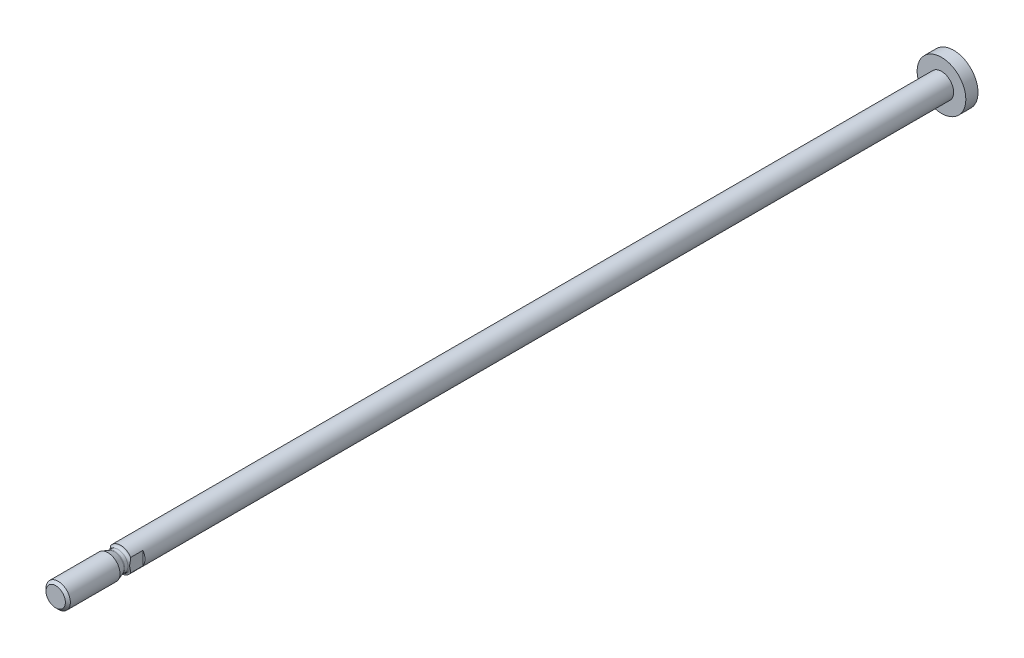
ISO-10303-21;
HEADER;
FILE_DESCRIPTION(('STEP AP214'),'2;1');
FILE_NAME('part.step','',(''),(''),'','','');
FILE_SCHEMA(('AUTOMOTIVE_DESIGN { 1 0 10303 214 1 1 1 1 }'));
ENDSEC;
DATA;
#1=APPLICATION_CONTEXT('core data for automotive mechanical design processes');
#2=APPLICATION_PROTOCOL_DEFINITION('international standard','automotive_design',2000,#1);
#3=PRODUCT_CONTEXT('',#1,'mechanical');
#4=PRODUCT('Part','Part','',(#3));
#5=PRODUCT_RELATED_PRODUCT_CATEGORY('part','',(#4));
#6=PRODUCT_DEFINITION_FORMATION('','',#4);
#7=PRODUCT_DEFINITION_CONTEXT('part definition',#1,'design');
#8=PRODUCT_DEFINITION('design','',#6,#7);
#9=PRODUCT_DEFINITION_SHAPE('','',#8);
#10=(LENGTH_UNIT() NAMED_UNIT(*) SI_UNIT(.MILLI.,.METRE.));
#11=(NAMED_UNIT(*) PLANE_ANGLE_UNIT() SI_UNIT($,.RADIAN.));
#12=(NAMED_UNIT(*) SI_UNIT($,.STERADIAN.) SOLID_ANGLE_UNIT());
#13=UNCERTAINTY_MEASURE_WITH_UNIT(LENGTH_MEASURE(1.E-05),#10,'distance_accuracy_value','');
#14=(GEOMETRIC_REPRESENTATION_CONTEXT(3) GLOBAL_UNCERTAINTY_ASSIGNED_CONTEXT((#13)) GLOBAL_UNIT_ASSIGNED_CONTEXT((#10,
#11,#12)) REPRESENTATION_CONTEXT('',''));
#15=CARTESIAN_POINT('',(0.,0.,0.));
#16=DIRECTION('',(0.,0.,1.));
#17=DIRECTION('',(1.,0.,0.));
#18=AXIS2_PLACEMENT_3D('',#15,#16,#17);
#19=CARTESIAN_POINT('',(0.,0.,-200.3));
#20=DIRECTION('',(0.,0.,1.));
#21=DIRECTION('',(1.,0.,0.));
#22=AXIS2_PLACEMENT_3D('',#19,#20,#21);
#23=CYLINDRICAL_SURFACE('',#22,3.);
#24=CARTESIAN_POINT('',(0.,0.,-197.3));
#25=DIRECTION('',(0.,0.,1.));
#26=DIRECTION('',(1.,0.,0.));
#27=AXIS2_PLACEMENT_3D('',#24,#25,#26);
#28=CIRCLE('',#27,3.);
#29=CARTESIAN_POINT('',(3.,0.,-197.3));
#30=VERTEX_POINT('',#29);
#31=EDGE_CURVE('E134',#30,#30,#28,.T.);
#32=ORIENTED_EDGE('',*,*,#31,.T.);
#33=EDGE_LOOP('',(#32));
#34=FACE_BOUND('',#33,.T.);
#35=DIRECTION('',(0.,0.,1.));
#36=VECTOR('',#35,1.);
#37=CARTESIAN_POINT('',(-2.5,-1.6583123951777,-200.3));
#38=LINE('',#37,#36);
#39=CARTESIAN_POINT('',(-2.5,-1.6583123951777,2.));
#40=VERTEX_POINT('',#39);
#41=CARTESIAN_POINT('',(-2.5,-1.6583123951777,5.));
#42=VERTEX_POINT('',#41);
#43=EDGE_CURVE('E64',#40,#42,#38,.T.);
#44=ORIENTED_EDGE('',*,*,#43,.F.);
#45=CARTESIAN_POINT('',(0.,0.,2.));
#46=DIRECTION('',(0.,0.,1.));
#47=DIRECTION('',(1.,0.,0.));
#48=AXIS2_PLACEMENT_3D('',#45,#46,#47);
#49=CIRCLE('',#48,3.);
#50=CARTESIAN_POINT('',(-2.5,1.6583123951777,2.));
#51=VERTEX_POINT('',#50);
#52=EDGE_CURVE('E13',#51,#40,#49,.T.);
#53=ORIENTED_EDGE('',*,*,#52,.F.);
#54=DIRECTION('',(0.,0.,1.));
#55=VECTOR('',#54,1.);
#56=CARTESIAN_POINT('',(-2.5,1.6583123951777,-200.3));
#57=LINE('',#56,#55);
#58=CARTESIAN_POINT('',(-2.5,1.65831239517778,4.99999999999909));
#59=VERTEX_POINT('',#58);
#60=EDGE_CURVE('E104',#59,#51,#57,.F.);
#61=ORIENTED_EDGE('',*,*,#60,.F.);
#62=CARTESIAN_POINT('',(0.,0.,5.));
#63=DIRECTION('',(0.,0.,1.));
#64=DIRECTION('',(1.,0.,0.));
#65=AXIS2_PLACEMENT_3D('',#62,#63,#64);
#66=CIRCLE('',#65,3.);
#67=CARTESIAN_POINT('',(2.5,1.6583123951777,5.));
#68=VERTEX_POINT('',#67);
#69=EDGE_CURVE('E103',#68,#59,#66,.T.);
#70=ORIENTED_EDGE('',*,*,#69,.F.);
#71=DIRECTION('',(0.,0.,1.));
#72=VECTOR('',#71,1.);
#73=CARTESIAN_POINT('',(2.5,1.6583123951777,-200.3));
#74=LINE('',#73,#72);
#75=CARTESIAN_POINT('',(2.5,1.6583123951777,2.));
#76=VERTEX_POINT('',#75);
#77=EDGE_CURVE('E72',#76,#68,#74,.T.);
#78=ORIENTED_EDGE('',*,*,#77,.F.);
#79=CARTESIAN_POINT('',(2.5,-1.6583123951777,2.));
#80=VERTEX_POINT('',#79);
#81=EDGE_CURVE('E53',#80,#76,#49,.T.);
#82=ORIENTED_EDGE('',*,*,#81,.F.);
#83=DIRECTION('',(0.,0.,1.));
#84=VECTOR('',#83,1.);
#85=CARTESIAN_POINT('',(2.5,-1.6583123951777,-200.3));
#86=LINE('',#85,#84);
#87=CARTESIAN_POINT('',(2.5,-1.65831239517778,4.99999999999909));
#88=VERTEX_POINT('',#87);
#89=EDGE_CURVE('E97',#88,#80,#86,.F.);
#90=ORIENTED_EDGE('',*,*,#89,.F.);
#91=EDGE_CURVE('E137',#42,#88,#66,.T.);
#92=ORIENTED_EDGE('',*,*,#91,.F.);
#93=EDGE_LOOP('',(#44,#53,#61,#70,#78,#82,#90,#92));
#94=FACE_BOUND('',#93,.T.);
#95=ADVANCED_FACE('F50',(#34,#94),#23,.T.);
#96=CARTESIAN_POINT('',(0.,0.,5.6000000000001));
#97=DIRECTION('',(0.,0.,1.));
#98=DIRECTION('',(1.,0.,0.));
#99=AXIS2_PLACEMENT_3D('',#96,#97,#98);
#100=TOROIDAL_SURFACE('',#99,3.0000000000001,0.600000000000099);
#101=CARTESIAN_POINT('',(0.,0.,5.6));
#102=DIRECTION('',(0.,0.,1.));
#103=DIRECTION('',(1.,0.,0.));
#104=AXIS2_PLACEMENT_3D('',#101,#102,#103);
#105=CIRCLE('',#104,2.4);
#106=CARTESIAN_POINT('',(2.4,0.,5.6));
#107=VERTEX_POINT('',#106);
#108=EDGE_CURVE('E125',#107,#107,#105,.T.);
#109=ORIENTED_EDGE('',*,*,#108,.F.);
#110=EDGE_LOOP('',(#109));
#111=FACE_BOUND('',#110,.T.);
#112=CARTESIAN_POINT('',(-2.5,0.,5.26833752096453));
#113=CARTESIAN_POINT('',(-2.5,0.0507234426297441,5.26834839993848));
#114=CARTESIAN_POINT('',(-2.5,0.101441776799662,5.26596843791489));
#115=CARTESIAN_POINT('',(-2.5,0.202536067556288,5.2569952015163));
#116=CARTESIAN_POINT('',(-2.5,0.252911588949165,5.2503973212644));
#117=CARTESIAN_POINT('',(-2.5,0.35392632203634,5.23403658213965));
#118=CARTESIAN_POINT('',(-2.5,0.404557369480025,5.224225913585));
#119=CARTESIAN_POINT('',(-2.5,0.505400398866161,5.20278595137819));
#120=CARTESIAN_POINT('',(-2.5,0.555612509775304,5.1911572409283));
#121=CARTESIAN_POINT('',(-2.5,0.655655613826413,5.16721678219831));
#122=CARTESIAN_POINT('',(-2.5,0.705487327239528,5.15490798008948));
#123=CARTESIAN_POINT('',(-2.5,0.805181864056362,5.13041893752706));
#124=CARTESIAN_POINT('',(-2.5,0.855044688832192,5.11823870324147));
#125=CARTESIAN_POINT('',(-2.5,1.00507376125951,5.08293674920261));
#126=CARTESIAN_POINT('',(-2.5,1.1055660279648,5.06108488117838));
#127=CARTESIAN_POINT('',(-2.5,1.30645493621981,5.02592717471424));
#128=CARTESIAN_POINT('',(-2.5,1.40682678389803,5.01248870030289));
#129=CARTESIAN_POINT('',(-2.5,1.60840199518987,4.99838763017595));
#130=CARTESIAN_POINT('',(-2.5,1.70960094347028,4.99767823287719));
#131=CARTESIAN_POINT('',(-2.5,1.86622781794818,5.01106448653587));
#132=CARTESIAN_POINT('',(-2.5,1.92218137883188,5.01877622049858));
#133=CARTESIAN_POINT('',(-2.5,2.03285053262341,5.0413651074687));
#134=CARTESIAN_POINT('',(-2.5,2.08756307823151,5.05625824117348));
#135=CARTESIAN_POINT('',(-2.5,2.18328084843635,5.09083457513036));
#136=CARTESIAN_POINT('',(-2.5,2.22483950461237,5.10896465354793));
#137=CARTESIAN_POINT('',(-2.5,2.30459524648064,5.1515245306446));
#138=CARTESIAN_POINT('',(-2.5,2.34279989724468,5.17593963670877));
#139=CARTESIAN_POINT('',(-2.5,2.40362753966407,5.22361594487622));
#140=CARTESIAN_POINT('',(-2.5,2.42757076392253,5.24518752529637));
#141=CARTESIAN_POINT('',(-2.5,2.47175757689057,5.29185573262645));
#142=CARTESIAN_POINT('',(-2.5,2.49200531158724,5.31694835263777));
#143=CARTESIAN_POINT('',(-2.5,2.52468492158815,5.36594738678137));
#144=CARTESIAN_POINT('',(-2.5,2.53785643218482,5.38935828111803));
#145=CARTESIAN_POINT('',(-2.5,2.56013164913301,5.43805384411947));
#146=CARTESIAN_POINT('',(-2.5,2.56923737677398,5.46333757440499));
#147=CARTESIAN_POINT('',(-2.5,2.58283057049981,5.51527496834575));
#148=CARTESIAN_POINT('',(-2.5,2.58729356105886,5.54193512227162));
#149=CARTESIAN_POINT('',(-2.5,2.59118020467599,5.59561989324821));
#150=CARTESIAN_POINT('',(-2.5,2.5906054179438,5.62264439487102));
#151=CARTESIAN_POINT('',(-2.5,2.5847447911938,5.67371298536964));
#152=CARTESIAN_POINT('',(-2.5,2.57988467167735,5.69780754958458));
#153=CARTESIAN_POINT('',(-2.5,2.56633022368149,5.74488485425705));
#154=CARTESIAN_POINT('',(-2.5,2.55763543991684,5.76786746233366));
#155=CARTESIAN_POINT('',(-2.5,2.53647695281551,5.81308697753744));
#156=CARTESIAN_POINT('',(-2.5,2.52388217742275,5.83526203314746));
#157=CARTESIAN_POINT('',(-2.5,2.49565831542702,5.87756858678122));
#158=CARTESIAN_POINT('',(-2.5,2.4800283022487,5.897699457906));
#159=CARTESIAN_POINT('',(-2.5,2.4381803160609,5.94494905141413));
#160=CARTESIAN_POINT('',(-2.5,2.41048793322772,5.97076525046522));
#161=CARTESIAN_POINT('',(-2.5,2.35128940318857,6.01762864695372));
#162=CARTESIAN_POINT('',(-2.5,2.31977194494069,6.03866114436212));
#163=CARTESIAN_POINT('',(-2.5,2.23952256294481,6.08463351159361));
#164=CARTESIAN_POINT('',(-2.5,2.18939204577726,6.10711912432076));
#165=CARTESIAN_POINT('',(-2.5,2.086424206848,6.14398267826286));
#166=CARTESIAN_POINT('',(-2.5,2.03358928965091,6.15836768991921));
#167=CARTESIAN_POINT('',(-2.5,1.93599580204544,6.17849484994285));
#168=CARTESIAN_POINT('',(-2.5,1.89144834077192,6.18531116329585));
#169=CARTESIAN_POINT('',(-2.5,1.80189908033616,6.19505697557448));
#170=CARTESIAN_POINT('',(-2.5,1.75689686177072,6.19798247787778));
#171=CARTESIAN_POINT('',(-2.5,1.66646832286127,6.20053377831371));
#172=CARTESIAN_POINT('',(-2.5,1.6210413945456,6.20013412759755));
#173=CARTESIAN_POINT('',(-2.5,1.53034280767568,6.19650595241103));
#174=CARTESIAN_POINT('',(-2.5,1.48507106445849,6.1932793543307));
#175=CARTESIAN_POINT('',(-2.5,1.33918047559004,6.17906735223514));
#176=CARTESIAN_POINT('',(-2.5,1.23902345631669,6.16342028964884));
#177=CARTESIAN_POINT('',(-2.5,1.03994836030368,6.12508984420092));
#178=CARTESIAN_POINT('',(-2.5,0.941034235224376,6.10238806221333));
#179=CARTESIAN_POINT('',(-2.5,0.793509038998567,6.06677672186832));
#180=CARTESIAN_POINT('',(-2.5,0.7446863854637,6.054702575567));
#181=CARTESIAN_POINT('',(-2.5,0.646996290398524,6.030738686552));
#182=CARTESIAN_POINT('',(-2.5,0.598128851070118,6.0188489352388));
#183=CARTESIAN_POINT('',(-2.5,0.500334281886721,5.99617397742217));
#184=CARTESIAN_POINT('',(-2.5,0.451408146263369,5.98538460255591));
#185=CARTESIAN_POINT('',(-2.5,0.353119090508098,5.96594052833405));
#186=CARTESIAN_POINT('',(-2.5,0.303756196305667,5.95728570312374));
#187=CARTESIAN_POINT('',(-2.5,0.204122497966492,5.94328110899502));
#188=CARTESIAN_POINT('',(-2.5,0.153847567097064,5.93795905985694));
#189=CARTESIAN_POINT('',(-2.5,0.0530351286873156,5.93177082830429));
#190=CARTESIAN_POINT('',(-2.5,0.0024977994589948,5.930901937583));
#191=CARTESIAN_POINT('',(-2.5,-0.0985305210715612,5.93381110626722));
#192=CARTESIAN_POINT('',(-2.5,-0.14902123482016,5.93759813511376));
#193=CARTESIAN_POINT('',(-2.5,-0.249573888409545,5.94904126176878));
#194=CARTESIAN_POINT('',(-2.5,-0.299635458091892,5.95670041313862));
#195=CARTESIAN_POINT('',(-2.5,-0.399725252919972,5.97472154484855));
#196=CARTESIAN_POINT('',(-2.5,-0.449748880216866,5.98510788708088));
#197=CARTESIAN_POINT('',(-2.5,-0.549453617514231,6.00732659888942));
#198=CARTESIAN_POINT('',(-2.5,-0.599134785603654,6.01915871651809));
#199=CARTESIAN_POINT('',(-2.5,-0.698392421521691,6.04328051823731));
#200=CARTESIAN_POINT('',(-2.5,-0.747968869022546,6.05557028383309));
#201=CARTESIAN_POINT('',(-2.5,-0.84720464589227,6.07981009984425));
#202=CARTESIAN_POINT('',(-2.5,-0.896863971124109,6.0917601667094));
#203=CARTESIAN_POINT('',(-2.5,-0.975241469303783,6.10978478042876));
#204=CARTESIAN_POINT('',(-2.5,-1.00388150216564,6.11619624816889));
#205=CARTESIAN_POINT('',(-2.5,-1.06125902675178,6.12857195456169));
#206=CARTESIAN_POINT('',(-2.5,-1.08999652018277,6.13453618533974));
#207=CARTESIAN_POINT('',(-2.5,-1.14748265723325,6.1458846074232));
#208=CARTESIAN_POINT('',(-2.5,-1.17623091126653,6.15127075206469));
#209=CARTESIAN_POINT('',(-2.5,-1.23384312688132,6.16137594760793));
#210=CARTESIAN_POINT('',(-2.5,-1.26270708577413,6.16609501391968));
#211=CARTESIAN_POINT('',(-2.5,-1.34949136584038,6.17908804539659));
#212=CARTESIAN_POINT('',(-2.5,-1.40759592627029,6.18619616796949));
#213=CARTESIAN_POINT('',(-2.5,-1.52420669712544,6.19636423685649));
#214=CARTESIAN_POINT('',(-2.5,-1.58271310503325,6.1994220245478));
#215=CARTESIAN_POINT('',(-2.5,-1.70911532678372,6.20051114496721));
#216=CARTESIAN_POINT('',(-2.5,-1.77702602049488,6.19766666103081));
#217=CARTESIAN_POINT('',(-2.5,-1.912149147007,6.18315262249392));
#218=CARTESIAN_POINT('',(-2.5,-1.97936016975703,6.17146782027944));
#219=CARTESIAN_POINT('',(-2.5,-2.09293467910467,6.14162835403314));
#220=CARTESIAN_POINT('',(-2.5,-2.1399801193776,6.12611102431254));
#221=CARTESIAN_POINT('',(-2.5,-2.23116163556241,6.08815370009842));
#222=CARTESIAN_POINT('',(-2.5,-2.27530548479003,6.06573319994486));
#223=CARTESIAN_POINT('',(-2.5,-2.34660579555824,6.0206656653127));
#224=CARTESIAN_POINT('',(-2.5,-2.37498330055351,5.99995880382842));
#225=CARTESIAN_POINT('',(-2.5,-2.42818185419372,5.95435228802646));
#226=CARTESIAN_POINT('',(-2.5,-2.45300628498281,5.92945667074117));
#227=CARTESIAN_POINT('',(-2.5,-2.49337206402375,5.88080957286876));
#228=CARTESIAN_POINT('',(-2.5,-2.50977972671913,5.85778028891266));
#229=CARTESIAN_POINT('',(-2.5,-2.5385948801776,5.80932543735906));
#230=CARTESIAN_POINT('',(-2.5,-2.55100468980703,5.7839012699618));
#231=CARTESIAN_POINT('',(-2.5,-2.57111606880391,5.7310152189761));
#232=CARTESIAN_POINT('',(-2.5,-2.57878240755407,5.70353974708557));
#233=CARTESIAN_POINT('',(-2.5,-2.58865812747843,5.64762323062993));
#234=CARTESIAN_POINT('',(-2.5,-2.59087093912576,5.61918280447873));
#235=CARTESIAN_POINT('',(-2.5,-2.58974032110845,5.56589468768046));
#236=CARTESIAN_POINT('',(-2.5,-2.58704036062141,5.54103102121321));
#237=CARTESIAN_POINT('',(-2.5,-2.57748265423562,5.49212434637714));
#238=CARTESIAN_POINT('',(-2.5,-2.57062518368025,5.46808128377277));
#239=CARTESIAN_POINT('',(-2.5,-2.55318309970271,5.42147694109437));
#240=CARTESIAN_POINT('',(-2.5,-2.54260847384664,5.39891188066154));
#241=CARTESIAN_POINT('',(-2.5,-2.51826231502416,5.35558968714916));
#242=CARTESIAN_POINT('',(-2.5,-2.50448933519591,5.33483337816906));
#243=CARTESIAN_POINT('',(-2.5,-2.46797257111134,5.28708275256527));
#244=CARTESIAN_POINT('',(-2.5,-2.44388663659998,5.26111270404154));
#245=CARTESIAN_POINT('',(-2.5,-2.39183121173732,5.21341702762138));
#246=CARTESIAN_POINT('',(-2.5,-2.36385414462067,5.19169988455002));
#247=CARTESIAN_POINT('',(-2.5,-2.29309604385226,5.14424955817408));
#248=CARTESIAN_POINT('',(-2.5,-2.24896151787955,5.12054273771195));
#249=CARTESIAN_POINT('',(-2.5,-2.15755724893995,5.08032986787273));
#250=CARTESIAN_POINT('',(-2.5,-2.1102815253453,5.0638380357592));
#251=CARTESIAN_POINT('',(-2.5,-1.98539576167196,5.02901994971649));
#252=CARTESIAN_POINT('',(-2.5,-1.90647682078743,5.01544295171964));
#253=CARTESIAN_POINT('',(-2.5,-1.74768813149434,5.00017484346382));
#254=CARTESIAN_POINT('',(-2.5,-1.66781762927049,4.99849388464395));
#255=CARTESIAN_POINT('',(-2.5,-1.45429321635247,5.00579419289827));
#256=CARTESIAN_POINT('',(-2.5,-1.32097329964418,5.02279704607492));
#257=CARTESIAN_POINT('',(-2.5,-1.12273292987174,5.05843900515103));
#258=CARTESIAN_POINT('',(-2.5,-1.05669317759064,5.07208123732001));
#259=CARTESIAN_POINT('',(-2.5,-0.925080173294097,5.10144856377507));
#260=CARTESIAN_POINT('',(-2.5,-0.85950678696237,5.11717303045709));
#261=CARTESIAN_POINT('',(-2.5,-0.728157455724953,5.14928145287764));
#262=CARTESIAN_POINT('',(-2.5,-0.662382356378558,5.16566853749943));
#263=CARTESIAN_POINT('',(-2.5,-0.530451230737349,5.19710748690057));
#264=CARTESIAN_POINT('',(-2.5,-0.46429498692756,5.21215848739435));
#265=CARTESIAN_POINT('',(-2.5,-0.332137198799993,5.23811298682939));
#266=CARTESIAN_POINT('',(-2.5,-0.266147995614798,5.24907485812429));
#267=CARTESIAN_POINT('',(-2.5,-0.13343508853748,5.26417313941374));
#268=CARTESIAN_POINT('',(-2.5,-0.0667131258677896,5.26832321258322));
#269=CARTESIAN_POINT('',(-2.5,0.,5.26833752096453));
#270=B_SPLINE_CURVE_WITH_KNOTS('',3,(#112,#113,#114,#115,#116,#117,#118,#119,#120,#121,#122,
#123,#124,#125,#126,#127,#128,#129,#130,#131,#132,#133,#134,#135,#136,#137,#138,#139,#140,#141,
#142,#143,#144,#145,#146,#147,#148,#149,#150,#151,#152,#153,#154,#155,#156,#157,#158,#159,#160,
#161,#162,#163,#164,#165,#166,#167,#168,#169,#170,#171,#172,#173,#174,#175,#176,#177,#178,#179,
#180,#181,#182,#183,#184,#185,#186,#187,#188,#189,#190,#191,#192,#193,#194,#195,#196,#197,#198,
#199,#200,#201,#202,#203,#204,#205,#206,#207,#208,#209,#210,#211,#212,#213,#214,#215,#216,#217,
#218,#219,#220,#221,#222,#223,#224,#225,#226,#227,#228,#229,#230,#231,#232,#233,#234,#235,#236,
#237,#238,#239,#240,#241,#242,#243,#244,#245,#246,#247,#248,#249,#250,#251,#252,#253,#254,#255,
#256,#257,#258,#259,#260,#261,#262,#263,#264,#265,#266,#267,#268,#269),.UNSPECIFIED.,.T.,.F.,(4,
2,2,2,2,2,2,2,2,2,2,2,2,2,2,2,2,2,2,2,2,2,2,2,2,2,2,2,2,2,2,2,2,2,2,2,2,2,2,2,2,2,2,2,2,2,2,2,2,
2,2,2,2,2,2,2,2,2,2,2,2,2,2,2,2,2,2,2,2,2,2,2,2,2,2,2,2,2,4),(0.,0.152115749462961,
0.304397890479205,0.459057777660119,0.613668153537359,0.76765452052503,0.921648241698668,
1.22999186740174,1.53334327295527,1.83557910296654,2.00468122496769,2.17416139710525,
2.30975526259906,2.44503498191611,2.54138706790922,2.63763038250484,2.71788414225495,
2.79809795959123,2.87873253660465,2.95934214181033,3.03274594433316,3.10615846435156,
3.18237030946167,3.25860545664829,3.37154774885102,3.48483255287211,3.64874326809032,
3.81251069461259,3.94751849926572,4.08266487644991,4.21884653384819,4.35493546397263,
4.65852821936571,4.96291950372185,5.11380283698696,5.2646791123006,5.41496078164642,
5.56523358814694,5.71674021710462,5.86815469233289,6.01986131905259,6.17168776888823,
6.3249195654772,6.47812469716163,6.63135724578266,6.7845823615018,6.87262624262423,
6.9606716735928,7.04840955727845,7.13614541382411,7.31164210225534,7.487232283928,
7.69072100095721,7.89456149389004,8.04275027379228,8.1905243529531,8.29556794817655,
8.40051087855684,8.48500651711341,8.56945305722983,8.65451949621374,8.73953241154295,
8.81419843639983,8.88885951681877,8.96332150589878,9.03781724571823,9.14348655987521,
9.24936459025057,9.39882327642183,9.54857516145059,9.78744806917548,10.0265247936209,
10.4280628477144,10.630387719692,10.8326517473681,11.0360188284461,11.239516519211,
11.439986712254,11.6400543065313),.UNSPECIFIED.);
#271=EDGE_CURVE('E95',#42,#59,#270,.T.);
#272=ORIENTED_EDGE('',*,*,#271,.F.);
#273=ORIENTED_EDGE('',*,*,#91,.T.);
#274=CARTESIAN_POINT('',(2.5,0.,5.26833752096453));
#275=CARTESIAN_POINT('',(2.5,-0.0507234426297441,5.26834839993848));
#276=CARTESIAN_POINT('',(2.5,-0.101441776799662,5.26596843791489));
#277=CARTESIAN_POINT('',(2.5,-0.202536067556288,5.2569952015163));
#278=CARTESIAN_POINT('',(2.5,-0.252911588949165,5.2503973212644));
#279=CARTESIAN_POINT('',(2.5,-0.35392632203634,5.23403658213965));
#280=CARTESIAN_POINT('',(2.5,-0.404557369480025,5.224225913585));
#281=CARTESIAN_POINT('',(2.5,-0.505400398866161,5.20278595137819));
#282=CARTESIAN_POINT('',(2.5,-0.555612509775304,5.1911572409283));
#283=CARTESIAN_POINT('',(2.5,-0.655655613826413,5.16721678219831));
#284=CARTESIAN_POINT('',(2.5,-0.705487327239528,5.15490798008948));
#285=CARTESIAN_POINT('',(2.5,-0.805181864056362,5.13041893752706));
#286=CARTESIAN_POINT('',(2.5,-0.855044688832192,5.11823870324147));
#287=CARTESIAN_POINT('',(2.5,-1.00507376125951,5.08293674920261));
#288=CARTESIAN_POINT('',(2.5,-1.1055660279648,5.06108488117838));
#289=CARTESIAN_POINT('',(2.5,-1.30645493621981,5.02592717471424));
#290=CARTESIAN_POINT('',(2.5,-1.40682678389803,5.01248870030289));
#291=CARTESIAN_POINT('',(2.5,-1.60840199518987,4.99838763017595));
#292=CARTESIAN_POINT('',(2.5,-1.70960094347028,4.99767823287719));
#293=CARTESIAN_POINT('',(2.5,-1.86622781794818,5.01106448653587));
#294=CARTESIAN_POINT('',(2.5,-1.92218137883188,5.01877622049858));
#295=CARTESIAN_POINT('',(2.5,-2.03285053262341,5.0413651074687));
#296=CARTESIAN_POINT('',(2.5,-2.08756307823151,5.05625824117348));
#297=CARTESIAN_POINT('',(2.5,-2.18328084843635,5.09083457513036));
#298=CARTESIAN_POINT('',(2.5,-2.22483950461237,5.10896465354793));
#299=CARTESIAN_POINT('',(2.5,-2.30459524648064,5.1515245306446));
#300=CARTESIAN_POINT('',(2.5,-2.34279989724468,5.17593963670877));
#301=CARTESIAN_POINT('',(2.5,-2.40362753966407,5.22361594487622));
#302=CARTESIAN_POINT('',(2.5,-2.42757076392253,5.24518752529637));
#303=CARTESIAN_POINT('',(2.5,-2.47175757689057,5.29185573262645));
#304=CARTESIAN_POINT('',(2.5,-2.49200531158724,5.31694835263777));
#305=CARTESIAN_POINT('',(2.5,-2.52468492158815,5.36594738678137));
#306=CARTESIAN_POINT('',(2.5,-2.53785643218482,5.38935828111803));
#307=CARTESIAN_POINT('',(2.5,-2.56013164913301,5.43805384411947));
#308=CARTESIAN_POINT('',(2.5,-2.56923737677398,5.46333757440499));
#309=CARTESIAN_POINT('',(2.5,-2.58283057049981,5.51527496834575));
#310=CARTESIAN_POINT('',(2.5,-2.58729356105886,5.54193512227162));
#311=CARTESIAN_POINT('',(2.5,-2.59118020467599,5.59561989324821));
#312=CARTESIAN_POINT('',(2.5,-2.5906054179438,5.62264439487102));
#313=CARTESIAN_POINT('',(2.5,-2.5847447911938,5.67371298536964));
#314=CARTESIAN_POINT('',(2.5,-2.57988467167735,5.69780754958458));
#315=CARTESIAN_POINT('',(2.5,-2.56633022368149,5.74488485425705));
#316=CARTESIAN_POINT('',(2.5,-2.55763543991684,5.76786746233366));
#317=CARTESIAN_POINT('',(2.5,-2.53647695281551,5.81308697753744));
#318=CARTESIAN_POINT('',(2.5,-2.52388217742275,5.83526203314746));
#319=CARTESIAN_POINT('',(2.5,-2.49565831542702,5.87756858678122));
#320=CARTESIAN_POINT('',(2.5,-2.4800283022487,5.897699457906));
#321=CARTESIAN_POINT('',(2.5,-2.4381803160609,5.94494905141413));
#322=CARTESIAN_POINT('',(2.5,-2.41048793322772,5.97076525046522));
#323=CARTESIAN_POINT('',(2.5,-2.35128940318857,6.01762864695372));
#324=CARTESIAN_POINT('',(2.5,-2.31977194494069,6.03866114436212));
#325=CARTESIAN_POINT('',(2.5,-2.23952256294481,6.08463351159361));
#326=CARTESIAN_POINT('',(2.5,-2.18939204577726,6.10711912432076));
#327=CARTESIAN_POINT('',(2.5,-2.086424206848,6.14398267826286));
#328=CARTESIAN_POINT('',(2.5,-2.03358928965091,6.15836768991921));
#329=CARTESIAN_POINT('',(2.5,-1.93599580204544,6.17849484994285));
#330=CARTESIAN_POINT('',(2.5,-1.89144834077192,6.18531116329585));
#331=CARTESIAN_POINT('',(2.5,-1.80189908033616,6.19505697557448));
#332=CARTESIAN_POINT('',(2.5,-1.75689686177072,6.19798247787778));
#333=CARTESIAN_POINT('',(2.5,-1.66646832286127,6.20053377831371));
#334=CARTESIAN_POINT('',(2.5,-1.6210413945456,6.20013412759755));
#335=CARTESIAN_POINT('',(2.5,-1.53034280767568,6.19650595241103));
#336=CARTESIAN_POINT('',(2.5,-1.48507106445849,6.1932793543307));
#337=CARTESIAN_POINT('',(2.5,-1.33918047559004,6.17906735223514));
#338=CARTESIAN_POINT('',(2.5,-1.23902345631669,6.16342028964884));
#339=CARTESIAN_POINT('',(2.5,-1.03994836030368,6.12508984420092));
#340=CARTESIAN_POINT('',(2.5,-0.941034235224376,6.10238806221333));
#341=CARTESIAN_POINT('',(2.5,-0.793509038998567,6.06677672186832));
#342=CARTESIAN_POINT('',(2.5,-0.7446863854637,6.054702575567));
#343=CARTESIAN_POINT('',(2.5,-0.646996290398524,6.030738686552));
#344=CARTESIAN_POINT('',(2.5,-0.598128851070118,6.0188489352388));
#345=CARTESIAN_POINT('',(2.5,-0.500334281886721,5.99617397742217));
#346=CARTESIAN_POINT('',(2.5,-0.451408146263369,5.98538460255591));
#347=CARTESIAN_POINT('',(2.5,-0.353119090508098,5.96594052833405));
#348=CARTESIAN_POINT('',(2.5,-0.303756196305667,5.95728570312374));
#349=CARTESIAN_POINT('',(2.5,-0.204122497966492,5.94328110899502));
#350=CARTESIAN_POINT('',(2.5,-0.153847567097064,5.93795905985694));
#351=CARTESIAN_POINT('',(2.5,-0.0530351286873156,5.93177082830429));
#352=CARTESIAN_POINT('',(2.5,-0.0024977994589948,5.930901937583));
#353=CARTESIAN_POINT('',(2.5,0.0985305210715612,5.93381110626722));
#354=CARTESIAN_POINT('',(2.5,0.14902123482016,5.93759813511376));
#355=CARTESIAN_POINT('',(2.5,0.249573888409545,5.94904126176878));
#356=CARTESIAN_POINT('',(2.5,0.299635458091892,5.95670041313862));
#357=CARTESIAN_POINT('',(2.5,0.399725252919972,5.97472154484855));
#358=CARTESIAN_POINT('',(2.5,0.449748880216866,5.98510788708088));
#359=CARTESIAN_POINT('',(2.5,0.549453617514231,6.00732659888942));
#360=CARTESIAN_POINT('',(2.5,0.599134785603654,6.01915871651809));
#361=CARTESIAN_POINT('',(2.5,0.698392421521691,6.04328051823731));
#362=CARTESIAN_POINT('',(2.5,0.747968869022546,6.05557028383309));
#363=CARTESIAN_POINT('',(2.5,0.84720464589227,6.07981009984425));
#364=CARTESIAN_POINT('',(2.5,0.896863971124109,6.0917601667094));
#365=CARTESIAN_POINT('',(2.5,0.975241469303783,6.10978478042876));
#366=CARTESIAN_POINT('',(2.5,1.00388150216564,6.11619624816889));
#367=CARTESIAN_POINT('',(2.5,1.06125902675178,6.12857195456169));
#368=CARTESIAN_POINT('',(2.5,1.08999652018277,6.13453618533974));
#369=CARTESIAN_POINT('',(2.5,1.14748265723325,6.1458846074232));
#370=CARTESIAN_POINT('',(2.5,1.17623091126653,6.15127075206469));
#371=CARTESIAN_POINT('',(2.5,1.23384312688132,6.16137594760793));
#372=CARTESIAN_POINT('',(2.5,1.26270708577413,6.16609501391968));
#373=CARTESIAN_POINT('',(2.5,1.34949136584038,6.17908804539659));
#374=CARTESIAN_POINT('',(2.5,1.40759592627029,6.18619616796949));
#375=CARTESIAN_POINT('',(2.5,1.52420669712544,6.19636423685649));
#376=CARTESIAN_POINT('',(2.5,1.58271310503325,6.1994220245478));
#377=CARTESIAN_POINT('',(2.5,1.70911532678372,6.20051114496721));
#378=CARTESIAN_POINT('',(2.5,1.77702602049488,6.19766666103081));
#379=CARTESIAN_POINT('',(2.5,1.912149147007,6.18315262249392));
#380=CARTESIAN_POINT('',(2.5,1.97936016975703,6.17146782027944));
#381=CARTESIAN_POINT('',(2.5,2.09293467910467,6.14162835403314));
#382=CARTESIAN_POINT('',(2.5,2.1399801193776,6.12611102431254));
#383=CARTESIAN_POINT('',(2.5,2.23116163556241,6.08815370009842));
#384=CARTESIAN_POINT('',(2.5,2.27530548479003,6.06573319994486));
#385=CARTESIAN_POINT('',(2.5,2.34660579555824,6.0206656653127));
#386=CARTESIAN_POINT('',(2.5,2.37498330055351,5.99995880382842));
#387=CARTESIAN_POINT('',(2.5,2.42818185419372,5.95435228802646));
#388=CARTESIAN_POINT('',(2.5,2.45300628498281,5.92945667074117));
#389=CARTESIAN_POINT('',(2.5,2.49337206402375,5.88080957286876));
#390=CARTESIAN_POINT('',(2.5,2.50977972671913,5.85778028891266));
#391=CARTESIAN_POINT('',(2.5,2.5385948801776,5.80932543735906));
#392=CARTESIAN_POINT('',(2.5,2.55100468980703,5.7839012699618));
#393=CARTESIAN_POINT('',(2.5,2.57111606880391,5.7310152189761));
#394=CARTESIAN_POINT('',(2.5,2.57878240755407,5.70353974708557));
#395=CARTESIAN_POINT('',(2.5,2.58865812747843,5.64762323062993));
#396=CARTESIAN_POINT('',(2.5,2.59087093912576,5.61918280447873));
#397=CARTESIAN_POINT('',(2.5,2.58974032110845,5.56589468768046));
#398=CARTESIAN_POINT('',(2.5,2.58704036062141,5.54103102121321));
#399=CARTESIAN_POINT('',(2.5,2.57748265423562,5.49212434637714));
#400=CARTESIAN_POINT('',(2.5,2.57062518368025,5.46808128377277));
#401=CARTESIAN_POINT('',(2.5,2.55318309970271,5.42147694109437));
#402=CARTESIAN_POINT('',(2.5,2.54260847384664,5.39891188066154));
#403=CARTESIAN_POINT('',(2.5,2.51826231502416,5.35558968714916));
#404=CARTESIAN_POINT('',(2.5,2.50448933519591,5.33483337816906));
#405=CARTESIAN_POINT('',(2.5,2.46797257111134,5.28708275256527));
#406=CARTESIAN_POINT('',(2.5,2.44388663659998,5.26111270404154));
#407=CARTESIAN_POINT('',(2.5,2.39183121173732,5.21341702762138));
#408=CARTESIAN_POINT('',(2.5,2.36385414462067,5.19169988455002));
#409=CARTESIAN_POINT('',(2.5,2.29309604385226,5.14424955817408));
#410=CARTESIAN_POINT('',(2.5,2.24896151787955,5.12054273771195));
#411=CARTESIAN_POINT('',(2.5,2.15755724893995,5.08032986787273));
#412=CARTESIAN_POINT('',(2.5,2.1102815253453,5.0638380357592));
#413=CARTESIAN_POINT('',(2.5,1.98539576167196,5.02901994971649));
#414=CARTESIAN_POINT('',(2.5,1.90647682078743,5.01544295171964));
#415=CARTESIAN_POINT('',(2.5,1.74768813149434,5.00017484346382));
#416=CARTESIAN_POINT('',(2.5,1.66781762927049,4.99849388464395));
#417=CARTESIAN_POINT('',(2.5,1.45429321635247,5.00579419289827));
#418=CARTESIAN_POINT('',(2.5,1.32097329964418,5.02279704607492));
#419=CARTESIAN_POINT('',(2.5,1.12273292987174,5.05843900515103));
#420=CARTESIAN_POINT('',(2.5,1.05669317759064,5.07208123732001));
#421=CARTESIAN_POINT('',(2.5,0.925080173294097,5.10144856377507));
#422=CARTESIAN_POINT('',(2.5,0.85950678696237,5.11717303045709));
#423=CARTESIAN_POINT('',(2.5,0.728157455724953,5.14928145287764));
#424=CARTESIAN_POINT('',(2.5,0.662382356378558,5.16566853749943));
#425=CARTESIAN_POINT('',(2.5,0.530451230737349,5.19710748690057));
#426=CARTESIAN_POINT('',(2.5,0.46429498692756,5.21215848739435));
#427=CARTESIAN_POINT('',(2.5,0.332137198799993,5.23811298682939));
#428=CARTESIAN_POINT('',(2.5,0.266147995614798,5.24907485812429));
#429=CARTESIAN_POINT('',(2.5,0.13343508853748,5.26417313941374));
#430=CARTESIAN_POINT('',(2.5,0.0667131258677896,5.26832321258322));
#431=CARTESIAN_POINT('',(2.5,0.,5.26833752096453));
#432=B_SPLINE_CURVE_WITH_KNOTS('',3,(#274,#275,#276,#277,#278,#279,#280,#281,#282,#283,#284,
#285,#286,#287,#288,#289,#290,#291,#292,#293,#294,#295,#296,#297,#298,#299,#300,#301,#302,#303,
#304,#305,#306,#307,#308,#309,#310,#311,#312,#313,#314,#315,#316,#317,#318,#319,#320,#321,#322,
#323,#324,#325,#326,#327,#328,#329,#330,#331,#332,#333,#334,#335,#336,#337,#338,#339,#340,#341,
#342,#343,#344,#345,#346,#347,#348,#349,#350,#351,#352,#353,#354,#355,#356,#357,#358,#359,#360,
#361,#362,#363,#364,#365,#366,#367,#368,#369,#370,#371,#372,#373,#374,#375,#376,#377,#378,#379,
#380,#381,#382,#383,#384,#385,#386,#387,#388,#389,#390,#391,#392,#393,#394,#395,#396,#397,#398,
#399,#400,#401,#402,#403,#404,#405,#406,#407,#408,#409,#410,#411,#412,#413,#414,#415,#416,#417,
#418,#419,#420,#421,#422,#423,#424,#425,#426,#427,#428,#429,#430,#431),.UNSPECIFIED.,.T.,.F.,(4,
2,2,2,2,2,2,2,2,2,2,2,2,2,2,2,2,2,2,2,2,2,2,2,2,2,2,2,2,2,2,2,2,2,2,2,2,2,2,2,2,2,2,2,2,2,2,2,2,
2,2,2,2,2,2,2,2,2,2,2,2,2,2,2,2,2,2,2,2,2,2,2,2,2,2,2,2,2,4),(0.,0.152115749462961,
0.304397890479205,0.459057777660119,0.613668153537359,0.76765452052503,0.921648241698668,
1.22999186740174,1.53334327295527,1.83557910296654,2.00468122496769,2.17416139710525,
2.30975526259906,2.44503498191611,2.54138706790922,2.63763038250484,2.71788414225495,
2.79809795959123,2.87873253660465,2.95934214181033,3.03274594433316,3.10615846435156,
3.18237030946167,3.25860545664829,3.37154774885102,3.48483255287211,3.64874326809032,
3.81251069461259,3.94751849926572,4.08266487644991,4.21884653384819,4.35493546397263,
4.65852821936571,4.96291950372185,5.11380283698696,5.2646791123006,5.41496078164642,
5.56523358814694,5.71674021710462,5.86815469233289,6.01986131905259,6.17168776888823,
6.3249195654772,6.47812469716163,6.63135724578266,6.7845823615018,6.87262624262423,
6.9606716735928,7.04840955727845,7.13614541382411,7.31164210225534,7.487232283928,
7.69072100095721,7.89456149389004,8.04275027379228,8.1905243529531,8.29556794817655,
8.40051087855684,8.48500651711341,8.56945305722983,8.65451949621374,8.73953241154295,
8.81419843639983,8.88885951681877,8.96332150589878,9.03781724571823,9.14348655987521,
9.24936459025057,9.39882327642183,9.54857516145059,9.78744806917548,10.0265247936209,
10.4280628477144,10.630387719692,10.8326517473681,11.0360188284461,11.239516519211,
11.439986712254,11.6400543065313),.UNSPECIFIED.);
#433=EDGE_CURVE('E139',#68,#88,#432,.T.);
#434=ORIENTED_EDGE('',*,*,#433,.F.);
#435=ORIENTED_EDGE('',*,*,#69,.T.);
#436=EDGE_LOOP('',(#272,#273,#434,#435));
#437=FACE_BOUND('',#436,.T.);
#438=ADVANCED_FACE('F149',(#111,#437),#100,.F.);
#439=CARTESIAN_POINT('',(0.,3.,-197.3));
#440=DIRECTION('',(0.,0.,-1.));
#441=DIRECTION('',(-1.,0.,0.));
#442=AXIS2_PLACEMENT_3D('',#439,#440,#441);
#443=PLANE('',#442);
#444=ORIENTED_EDGE('',*,*,#31,.F.);
#445=EDGE_LOOP('',(#444));
#446=FACE_BOUND('',#445,.T.);
#447=CARTESIAN_POINT('',(0.,0.,-197.3));
#448=DIRECTION('',(0.,0.,1.));
#449=DIRECTION('',(1.,0.,0.));
#450=AXIS2_PLACEMENT_3D('',#447,#448,#449);
#451=CIRCLE('',#450,6.);
#452=CARTESIAN_POINT('',(6.,0.,-197.3));
#453=VERTEX_POINT('',#452);
#454=EDGE_CURVE('E131',#453,#453,#451,.T.);
#455=ORIENTED_EDGE('',*,*,#454,.T.);
#456=EDGE_LOOP('',(#455));
#457=FACE_BOUND('',#456,.T.);
#458=ADVANCED_FACE('F196',(#446,#457),#443,.F.);
#459=CARTESIAN_POINT('',(0.,0.,-200.3));
#460=DIRECTION('',(0.,0.,1.));
#461=DIRECTION('',(1.,0.,0.));
#462=AXIS2_PLACEMENT_3D('',#459,#460,#461);
#463=CYLINDRICAL_SURFACE('',#462,6.);
#464=ORIENTED_EDGE('',*,*,#454,.F.);
#465=EDGE_LOOP('',(#464));
#466=FACE_BOUND('',#465,.T.);
#467=CARTESIAN_POINT('',(0.,0.,-200.3));
#468=DIRECTION('',(0.,0.,1.));
#469=DIRECTION('',(1.,0.,0.));
#470=AXIS2_PLACEMENT_3D('',#467,#468,#469);
#471=CIRCLE('',#470,6.);
#472=CARTESIAN_POINT('',(6.,0.,-200.3));
#473=VERTEX_POINT('',#472);
#474=EDGE_CURVE('E128',#473,#473,#471,.T.);
#475=ORIENTED_EDGE('',*,*,#474,.T.);
#476=EDGE_LOOP('',(#475));
#477=FACE_BOUND('',#476,.T.);
#478=ADVANCED_FACE('F187',(#466,#477),#463,.T.);
#479=CARTESIAN_POINT('',(0.,6.,-200.3));
#480=DIRECTION('',(0.,0.,1.));
#481=DIRECTION('',(1.,0.,0.));
#482=AXIS2_PLACEMENT_3D('',#479,#480,#481);
#483=PLANE('',#482);
#484=ORIENTED_EDGE('',*,*,#474,.F.);
#485=EDGE_LOOP('',(#484));
#486=FACE_BOUND('',#485,.T.);
#487=ADVANCED_FACE('F182',(#486),#483,.F.);
#488=CARTESIAN_POINT('',(0.,0.,4.));
#489=DIRECTION('',(0.,0.,1.));
#490=DIRECTION('',(1.,0.,0.));
#491=AXIS2_PLACEMENT_3D('',#488,#489,#490);
#492=CYLINDRICAL_SURFACE('',#491,2.4);
#493=CARTESIAN_POINT('',(0.,0.,6.3942038115749));
#494=DIRECTION('',(0.,0.,1.));
#495=DIRECTION('',(1.,0.,0.));
#496=AXIS2_PLACEMENT_3D('',#493,#494,#495);
#497=CIRCLE('',#496,2.4);
#498=CARTESIAN_POINT('',(2.4,0.,6.3942038115749));
#499=VERTEX_POINT('',#498);
#500=EDGE_CURVE('E122',#499,#499,#497,.T.);
#501=ORIENTED_EDGE('',*,*,#500,.F.);
#502=EDGE_LOOP('',(#501));
#503=FACE_BOUND('',#502,.T.);
#504=ORIENTED_EDGE('',*,*,#108,.T.);
#505=EDGE_LOOP('',(#504));
#506=FACE_BOUND('',#505,.T.);
#507=ADVANCED_FACE('F179',(#503,#506),#492,.T.);
#508=CARTESIAN_POINT('',(0.,0.,6.39420381157482));
#509=DIRECTION('',(0.,0.,1.));
#510=DIRECTION('',(1.,0.,0.));
#511=AXIS2_PLACEMENT_3D('',#508,#509,#510);
#512=TOROIDAL_SURFACE('',#511,2.99999999999972,0.599999999999719);
#513=CARTESIAN_POINT('',(0.,0.,6.5994158975703));
#514=DIRECTION('',(0.,0.,1.));
#515=DIRECTION('',(1.,0.,0.));
#516=AXIS2_PLACEMENT_3D('',#513,#514,#515);
#517=CIRCLE('',#516,2.4361844275285);
#518=CARTESIAN_POINT('',(2.4361844275285,0.,6.5994158975703));
#519=VERTEX_POINT('',#518);
#520=EDGE_CURVE('E119',#519,#519,#517,.T.);
#521=ORIENTED_EDGE('',*,*,#520,.F.);
#522=EDGE_LOOP('',(#521));
#523=FACE_BOUND('',#522,.T.);
#524=ORIENTED_EDGE('',*,*,#500,.T.);
#525=EDGE_LOOP('',(#524));
#526=FACE_BOUND('',#525,.T.);
#527=ADVANCED_FACE('F176',(#523,#526),#512,.F.);
#528=CARTESIAN_POINT('',(0.,0.,6.5994158975703));
#529=DIRECTION('',(0.,0.,1.));
#530=DIRECTION('',(1.,0.,0.));
#531=AXIS2_PLACEMENT_3D('',#528,#529,#530);
#532=CONICAL_SURFACE('',#531,2.4361844275285,0.34906585039883);
#533=CARTESIAN_POINT('',(0.,0.,8.1484864516728));
#534=DIRECTION('',(0.,0.,1.));
#535=DIRECTION('',(1.,0.,0.));
#536=AXIS2_PLACEMENT_3D('',#533,#534,#535);
#537=CIRCLE('',#536,3.);
#538=CARTESIAN_POINT('',(3.,0.,8.1484864516728));
#539=VERTEX_POINT('',#538);
#540=EDGE_CURVE('E116',#539,#539,#537,.T.);
#541=ORIENTED_EDGE('',*,*,#540,.F.);
#542=EDGE_LOOP('',(#541));
#543=FACE_BOUND('',#542,.T.);
#544=ORIENTED_EDGE('',*,*,#520,.T.);
#545=EDGE_LOOP('',(#544));
#546=FACE_BOUND('',#545,.T.);
#547=ADVANCED_FACE('F172',(#543,#546),#532,.T.);
#548=CARTESIAN_POINT('',(0.,0.,4.));
#549=DIRECTION('',(0.,0.,1.));
#550=DIRECTION('',(1.,0.,0.));
#551=AXIS2_PLACEMENT_3D('',#548,#549,#550);
#552=CYLINDRICAL_SURFACE('',#551,3.);
#553=CARTESIAN_POINT('',(0.,0.,20.3865));
#554=DIRECTION('',(0.,0.,1.));
#555=DIRECTION('',(1.,0.,0.));
#556=AXIS2_PLACEMENT_3D('',#553,#554,#555);
#557=CIRCLE('',#556,3.);
#558=CARTESIAN_POINT('',(3.,0.,20.3865));
#559=VERTEX_POINT('',#558);
#560=EDGE_CURVE('E113',#559,#559,#557,.T.);
#561=ORIENTED_EDGE('',*,*,#560,.F.);
#562=EDGE_LOOP('',(#561));
#563=FACE_BOUND('',#562,.T.);
#564=ORIENTED_EDGE('',*,*,#540,.T.);
#565=EDGE_LOOP('',(#564));
#566=FACE_BOUND('',#565,.T.);
#567=ADVANCED_FACE('F168',(#563,#566),#552,.T.);
#568=CARTESIAN_POINT('',(0.,0.,20.3865));
#569=DIRECTION('',(0.,0.,-1.));
#570=DIRECTION('',(-1.,0.,0.));
#571=AXIS2_PLACEMENT_3D('',#568,#569,#570);
#572=CONICAL_SURFACE('',#571,3.,0.785398163397449);
#573=CARTESIAN_POINT('',(0.,0.,21.));
#574=DIRECTION('',(0.,0.,1.));
#575=DIRECTION('',(1.,0.,0.));
#576=AXIS2_PLACEMENT_3D('',#573,#574,#575);
#577=CIRCLE('',#576,2.3865);
#578=CARTESIAN_POINT('',(2.3865,0.,21.));
#579=VERTEX_POINT('',#578);
#580=EDGE_CURVE('E110',#579,#579,#577,.T.);
#581=ORIENTED_EDGE('',*,*,#580,.F.);
#582=EDGE_LOOP('',(#581));
#583=FACE_BOUND('',#582,.T.);
#584=ORIENTED_EDGE('',*,*,#560,.T.);
#585=EDGE_LOOP('',(#584));
#586=FACE_BOUND('',#585,.T.);
#587=ADVANCED_FACE('F164',(#583,#586),#572,.T.);
#588=CARTESIAN_POINT('',(0.,0.,21.));
#589=DIRECTION('',(0.,0.,-1.));
#590=DIRECTION('',(-1.,0.,0.));
#591=AXIS2_PLACEMENT_3D('',#588,#589,#590);
#592=PLANE('',#591);
#593=ORIENTED_EDGE('',*,*,#580,.T.);
#594=EDGE_LOOP('',(#593));
#595=FACE_BOUND('',#594,.T.);
#596=ADVANCED_FACE('F156',(#595),#592,.F.);
#597=CARTESIAN_POINT('',(2.5,5.,6.));
#598=DIRECTION('',(1.,0.,0.));
#599=DIRECTION('',(0.,0.,-1.));
#600=AXIS2_PLACEMENT_3D('',#597,#598,#599);
#601=PLANE('',#600);
#602=ORIENTED_EDGE('',*,*,#77,.T.);
#603=ORIENTED_EDGE('',*,*,#433,.T.);
#604=ORIENTED_EDGE('',*,*,#89,.T.);
#605=DIRECTION('',(0.,-1.,0.));
#606=VECTOR('',#605,1.);
#607=CARTESIAN_POINT('',(2.5,5.,2.));
#608=LINE('',#607,#606);
#609=EDGE_CURVE('E92',#76,#80,#608,.T.);
#610=ORIENTED_EDGE('',*,*,#609,.F.);
#611=EDGE_LOOP('',(#602,#603,#604,#610));
#612=FACE_BOUND('',#611,.T.);
#613=ADVANCED_FACE('F96',(#612),#601,.T.);
#614=CARTESIAN_POINT('',(0.,0.,2.));
#615=DIRECTION('',(0.,0.,1.));
#616=DIRECTION('',(1.,0.,0.));
#617=AXIS2_PLACEMENT_3D('',#614,#615,#616);
#618=PLANE('',#617);
#619=ORIENTED_EDGE('',*,*,#81,.T.);
#620=ORIENTED_EDGE('',*,*,#609,.T.);
#621=EDGE_LOOP('',(#619,#620));
#622=FACE_BOUND('',#621,.T.);
#623=ADVANCED_FACE('F91',(#622),#618,.T.);
#624=ORIENTED_EDGE('',*,*,#52,.T.);
#625=DIRECTION('',(0.,1.,0.));
#626=VECTOR('',#625,1.);
#627=CARTESIAN_POINT('',(-2.5,-5.,2.));
#628=LINE('',#627,#626);
#629=EDGE_CURVE('E98',#40,#51,#628,.T.);
#630=ORIENTED_EDGE('',*,*,#629,.T.);
#631=EDGE_LOOP('',(#624,#630));
#632=FACE_BOUND('',#631,.T.);
#633=ADVANCED_FACE('F157',(#632),#618,.T.);
#634=CARTESIAN_POINT('',(-2.5,-5.,6.));
#635=DIRECTION('',(-1.,0.,0.));
#636=DIRECTION('',(0.,0.,1.));
#637=AXIS2_PLACEMENT_3D('',#634,#635,#636);
#638=PLANE('',#637);
#639=ORIENTED_EDGE('',*,*,#43,.T.);
#640=ORIENTED_EDGE('',*,*,#271,.T.);
#641=ORIENTED_EDGE('',*,*,#60,.T.);
#642=ORIENTED_EDGE('',*,*,#629,.F.);
#643=EDGE_LOOP('',(#639,#640,#641,#642));
#644=FACE_BOUND('',#643,.T.);
#645=ADVANCED_FACE('F158',(#644),#638,.T.);
#646=CLOSED_SHELL('',(#95,#438,#458,#478,#487,#507,#527,#547,#567,#587,#596,#613,#623,#633,#645));
#647=MANIFOLD_SOLID_BREP('B2',#646);
#648=ADVANCED_BREP_SHAPE_REPRESENTATION('',(#18,#647),#14);
#649=SHAPE_DEFINITION_REPRESENTATION(#9,#648);
ENDSEC;
END-ISO-10303-21;
